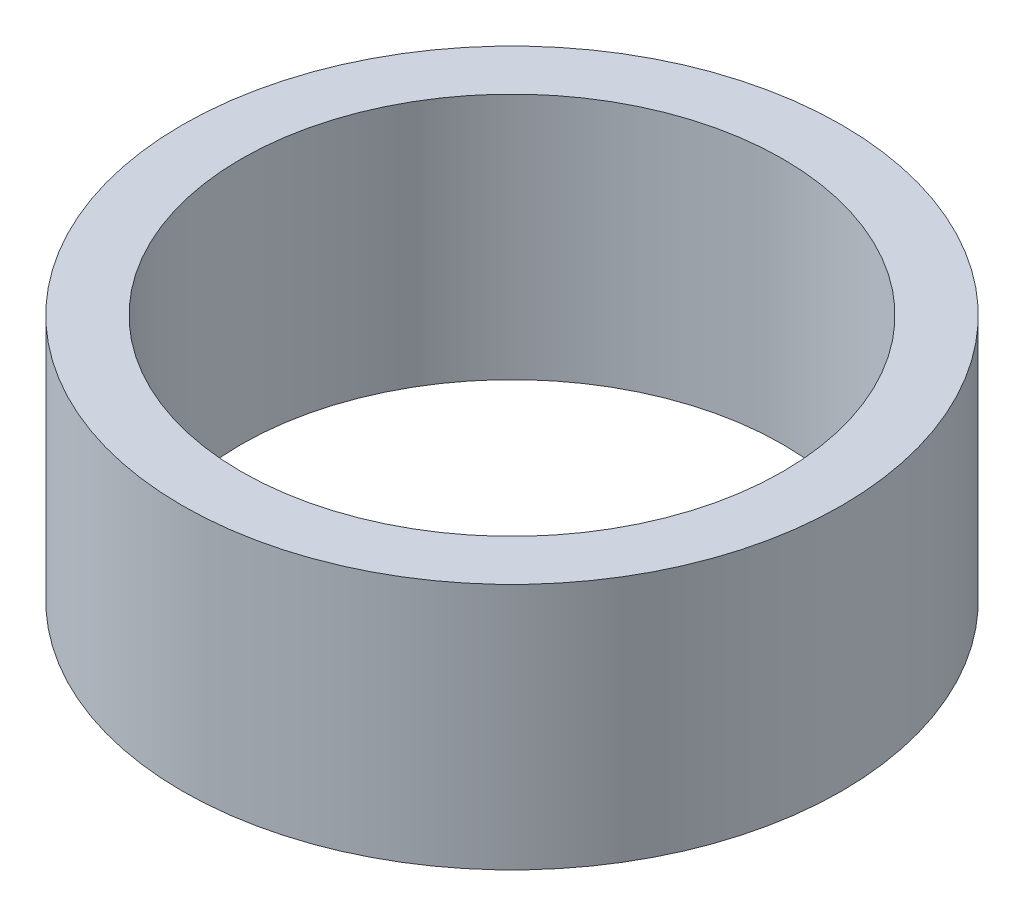
ISO-10303-21;
HEADER;
FILE_DESCRIPTION(('STEP AP214'),'2;1');
FILE_NAME('part.step','',(''),(''),'','','');
FILE_SCHEMA(('AUTOMOTIVE_DESIGN { 1 0 10303 214 1 1 1 1 }'));
ENDSEC;
DATA;
#1=APPLICATION_CONTEXT('core data for automotive mechanical design processes');
#2=APPLICATION_PROTOCOL_DEFINITION('international standard','automotive_design',2000,#1);
#3=PRODUCT_CONTEXT('',#1,'mechanical');
#4=PRODUCT('Part','Part','',(#3));
#5=PRODUCT_RELATED_PRODUCT_CATEGORY('part','',(#4));
#6=PRODUCT_DEFINITION_FORMATION('','',#4);
#7=PRODUCT_DEFINITION_CONTEXT('part definition',#1,'design');
#8=PRODUCT_DEFINITION('design','',#6,#7);
#9=PRODUCT_DEFINITION_SHAPE('','',#8);
#10=(LENGTH_UNIT() NAMED_UNIT(*) SI_UNIT(.MILLI.,.METRE.));
#11=(NAMED_UNIT(*) PLANE_ANGLE_UNIT() SI_UNIT($,.RADIAN.));
#12=(NAMED_UNIT(*) SI_UNIT($,.STERADIAN.) SOLID_ANGLE_UNIT());
#13=UNCERTAINTY_MEASURE_WITH_UNIT(LENGTH_MEASURE(1.E-05),#10,'distance_accuracy_value','');
#14=(GEOMETRIC_REPRESENTATION_CONTEXT(3) GLOBAL_UNCERTAINTY_ASSIGNED_CONTEXT((#13)) GLOBAL_UNIT_ASSIGNED_CONTEXT((#10,
#11,#12)) REPRESENTATION_CONTEXT('',''));
#15=CARTESIAN_POINT('',(0.,0.,0.));
#16=DIRECTION('',(0.,0.,1.));
#17=DIRECTION('',(1.,0.,0.));
#18=AXIS2_PLACEMENT_3D('',#15,#16,#17);
#19=CARTESIAN_POINT('',(0.,10.5,0.));
#20=DIRECTION('',(0.,1.,0.));
#21=DIRECTION('',(0.,0.,1.));
#22=AXIS2_PLACEMENT_3D('',#19,#20,#21);
#23=PLANE('',#22);
#24=CARTESIAN_POINT('',(0.,10.5,0.));
#25=DIRECTION('',(0.,1.,0.));
#26=DIRECTION('',(0.,0.,1.));
#27=AXIS2_PLACEMENT_3D('',#24,#25,#26);
#28=CIRCLE('',#27,14.);
#29=CARTESIAN_POINT('',(0.,10.5,-14.));
#30=VERTEX_POINT('',#29);
#31=EDGE_CURVE('E10',#30,#30,#28,.T.);
#32=ORIENTED_EDGE('',*,*,#31,.T.);
#33=EDGE_LOOP('',(#32));
#34=FACE_BOUND('',#33,.T.);
#35=CARTESIAN_POINT('',(0.,10.5,0.));
#36=DIRECTION('',(0.,1.,0.));
#37=DIRECTION('',(0.,0.,1.));
#38=AXIS2_PLACEMENT_3D('',#35,#36,#37);
#39=CIRCLE('',#38,11.5);
#40=CARTESIAN_POINT('',(0.,10.5,-11.5));
#41=VERTEX_POINT('',#40);
#42=EDGE_CURVE('E42',#41,#41,#39,.T.);
#43=ORIENTED_EDGE('',*,*,#42,.F.);
#44=EDGE_LOOP('',(#43));
#45=FACE_BOUND('',#44,.T.);
#46=ADVANCED_FACE('F31',(#34,#45),#23,.T.);
#47=CARTESIAN_POINT('',(0.,0.,0.));
#48=DIRECTION('',(0.,1.,0.));
#49=DIRECTION('',(0.,0.,1.));
#50=AXIS2_PLACEMENT_3D('',#47,#48,#49);
#51=PLANE('',#50);
#52=CARTESIAN_POINT('',(0.,0.,0.));
#53=DIRECTION('',(0.,1.,0.));
#54=DIRECTION('',(0.,0.,1.));
#55=AXIS2_PLACEMENT_3D('',#52,#53,#54);
#56=CIRCLE('',#55,14.);
#57=CARTESIAN_POINT('',(0.,0.,-14.));
#58=VERTEX_POINT('',#57);
#59=EDGE_CURVE('E35',#58,#58,#56,.T.);
#60=ORIENTED_EDGE('',*,*,#59,.F.);
#61=EDGE_LOOP('',(#60));
#62=FACE_BOUND('',#61,.T.);
#63=CARTESIAN_POINT('',(0.,0.,0.));
#64=DIRECTION('',(0.,1.,0.));
#65=DIRECTION('',(0.,0.,1.));
#66=AXIS2_PLACEMENT_3D('',#63,#64,#65);
#67=CIRCLE('',#66,11.5);
#68=CARTESIAN_POINT('',(0.,0.,-11.5));
#69=VERTEX_POINT('',#68);
#70=EDGE_CURVE('E44',#69,#69,#67,.T.);
#71=ORIENTED_EDGE('',*,*,#70,.T.);
#72=EDGE_LOOP('',(#71));
#73=FACE_BOUND('',#72,.T.);
#74=ADVANCED_FACE('F54',(#62,#73),#51,.F.);
#75=CARTESIAN_POINT('',(0.,10.5,0.));
#76=DIRECTION('',(0.,-1.,0.));
#77=DIRECTION('',(0.,0.,-1.));
#78=AXIS2_PLACEMENT_3D('',#75,#76,#77);
#79=CYLINDRICAL_SURFACE('',#78,14.);
#80=CARTESIAN_POINT('',(0.,10.5,-14.));
#81=CARTESIAN_POINT('',(0.,10.390625,-14.));
#82=CARTESIAN_POINT('',(0.,10.28125,-14.));
#83=CARTESIAN_POINT('',(0.,10.0625,-14.));
#84=CARTESIAN_POINT('',(0.,9.953125,-14.));
#85=CARTESIAN_POINT('',(0.,9.734375,-14.));
#86=CARTESIAN_POINT('',(0.,9.625,-14.));
#87=CARTESIAN_POINT('',(0.,9.40625,-14.));
#88=CARTESIAN_POINT('',(0.,9.296875,-14.));
#89=CARTESIAN_POINT('',(0.,9.078125,-14.));
#90=CARTESIAN_POINT('',(0.,8.96875,-14.));
#91=CARTESIAN_POINT('',(0.,8.75,-14.));
#92=CARTESIAN_POINT('',(0.,8.640625,-14.));
#93=CARTESIAN_POINT('',(0.,8.421875,-14.));
#94=CARTESIAN_POINT('',(0.,8.3125,-14.));
#95=CARTESIAN_POINT('',(0.,8.09375,-14.));
#96=CARTESIAN_POINT('',(0.,7.984375,-14.));
#97=CARTESIAN_POINT('',(0.,7.765625,-14.));
#98=CARTESIAN_POINT('',(0.,7.65625,-14.));
#99=CARTESIAN_POINT('',(0.,7.4375,-14.));
#100=CARTESIAN_POINT('',(0.,7.328125,-14.));
#101=CARTESIAN_POINT('',(0.,7.109375,-14.));
#102=CARTESIAN_POINT('',(0.,7.,-14.));
#103=CARTESIAN_POINT('',(0.,6.78125,-14.));
#104=CARTESIAN_POINT('',(0.,6.671875,-14.));
#105=CARTESIAN_POINT('',(0.,6.453125,-14.));
#106=CARTESIAN_POINT('',(0.,6.34375,-14.));
#107=CARTESIAN_POINT('',(0.,6.125,-14.));
#108=CARTESIAN_POINT('',(0.,6.015625,-14.));
#109=CARTESIAN_POINT('',(0.,5.796875,-14.));
#110=CARTESIAN_POINT('',(0.,5.6875,-14.));
#111=CARTESIAN_POINT('',(0.,5.46875,-14.));
#112=CARTESIAN_POINT('',(0.,5.359375,-14.));
#113=CARTESIAN_POINT('',(0.,5.140625,-14.));
#114=CARTESIAN_POINT('',(0.,5.03125,-14.));
#115=CARTESIAN_POINT('',(0.,4.8125,-14.));
#116=CARTESIAN_POINT('',(0.,4.703125,-14.));
#117=CARTESIAN_POINT('',(0.,4.484375,-14.));
#118=CARTESIAN_POINT('',(0.,4.375,-14.));
#119=CARTESIAN_POINT('',(0.,4.15625,-14.));
#120=CARTESIAN_POINT('',(0.,4.046875,-14.));
#121=CARTESIAN_POINT('',(0.,3.828125,-14.));
#122=CARTESIAN_POINT('',(0.,3.71875,-14.));
#123=CARTESIAN_POINT('',(0.,3.5,-14.));
#124=CARTESIAN_POINT('',(0.,3.390625,-14.));
#125=CARTESIAN_POINT('',(0.,3.171875,-14.));
#126=CARTESIAN_POINT('',(0.,3.0625,-14.));
#127=CARTESIAN_POINT('',(0.,2.84375,-14.));
#128=CARTESIAN_POINT('',(0.,2.734375,-14.));
#129=CARTESIAN_POINT('',(0.,2.515625,-14.));
#130=CARTESIAN_POINT('',(0.,2.40625,-14.));
#131=CARTESIAN_POINT('',(0.,2.1875,-14.));
#132=CARTESIAN_POINT('',(0.,2.078125,-14.));
#133=CARTESIAN_POINT('',(0.,1.859375,-14.));
#134=CARTESIAN_POINT('',(0.,1.75,-14.));
#135=CARTESIAN_POINT('',(0.,1.53125,-14.));
#136=CARTESIAN_POINT('',(0.,1.421875,-14.));
#137=CARTESIAN_POINT('',(0.,1.203125,-14.));
#138=CARTESIAN_POINT('',(0.,1.09375,-14.));
#139=CARTESIAN_POINT('',(0.,0.875000000000001,-14.));
#140=CARTESIAN_POINT('',(0.,0.765625000000001,-14.));
#141=CARTESIAN_POINT('',(0.,0.546875,-14.));
#142=CARTESIAN_POINT('',(0.,0.4375,-14.));
#143=CARTESIAN_POINT('',(0.,0.21875,-14.));
#144=CARTESIAN_POINT('',(0.,0.109375,-14.));
#145=CARTESIAN_POINT('',(0.,0.,-14.));
#146=B_SPLINE_CURVE_WITH_KNOTS('',3,(#80,#81,#82,#83,#84,#85,#86,#87,#88,#89,#90,#91,#92,#93,
#94,#95,#96,#97,#98,#99,#100,#101,#102,#103,#104,#105,#106,#107,#108,#109,#110,#111,#112,#113,
#114,#115,#116,#117,#118,#119,#120,#121,#122,#123,#124,#125,#126,#127,#128,#129,#130,#131,#132,
#133,#134,#135,#136,#137,#138,#139,#140,#141,#142,#143,#144,#145),.UNSPECIFIED.,.F.,.F.,(4,2,2,
2,2,2,2,2,2,2,2,2,2,2,2,2,2,2,2,2,2,2,2,2,2,2,2,2,2,2,2,2,4),(0.,0.328125,0.656250000000001,
0.984375000000001,1.3125,1.640625,1.96875,2.296875,2.625,2.953125,3.28125,3.609375,3.9375,
4.265625,4.59375,4.921875,5.25,5.578125,5.90625,6.234375,6.5625,6.890625,7.21875,7.546875,7.875,
8.203125,8.53125,8.859375,9.1875,9.515625,9.84375,10.171875,10.5),.UNSPECIFIED.);
#147=EDGE_CURVE('BSEAM33',#30,#58,#146,.T.);
#148=ORIENTED_EDGE('',*,*,#31,.F.);
#149=ORIENTED_EDGE('',*,*,#59,.T.);
#150=ORIENTED_EDGE('',*,*,#147,.T.);
#151=ORIENTED_EDGE('',*,*,#147,.F.);
#152=EDGE_LOOP('',(#148,#150,#149,#151));
#153=FACE_BOUND('',#152,.T.);
#154=ADVANCED_FACE('F33',(#153),#79,.T.);
#155=CARTESIAN_POINT('',(0.,10.5,0.));
#156=DIRECTION('',(0.,-1.,0.));
#157=DIRECTION('',(0.,0.,-1.));
#158=AXIS2_PLACEMENT_3D('',#155,#156,#157);
#159=CYLINDRICAL_SURFACE('',#158,11.5);
#160=CARTESIAN_POINT('',(0.,10.5,-11.5));
#161=CARTESIAN_POINT('',(0.,10.390625,-11.5));
#162=CARTESIAN_POINT('',(0.,10.28125,-11.5));
#163=CARTESIAN_POINT('',(0.,10.0625,-11.5));
#164=CARTESIAN_POINT('',(0.,9.953125,-11.5));
#165=CARTESIAN_POINT('',(0.,9.734375,-11.5));
#166=CARTESIAN_POINT('',(0.,9.625,-11.5));
#167=CARTESIAN_POINT('',(0.,9.40625,-11.5));
#168=CARTESIAN_POINT('',(0.,9.296875,-11.5));
#169=CARTESIAN_POINT('',(0.,9.078125,-11.5));
#170=CARTESIAN_POINT('',(0.,8.96875,-11.5));
#171=CARTESIAN_POINT('',(0.,8.75,-11.5));
#172=CARTESIAN_POINT('',(0.,8.640625,-11.5));
#173=CARTESIAN_POINT('',(0.,8.421875,-11.5));
#174=CARTESIAN_POINT('',(0.,8.3125,-11.5));
#175=CARTESIAN_POINT('',(0.,8.09375,-11.5));
#176=CARTESIAN_POINT('',(0.,7.984375,-11.5));
#177=CARTESIAN_POINT('',(0.,7.765625,-11.5));
#178=CARTESIAN_POINT('',(0.,7.65625,-11.5));
#179=CARTESIAN_POINT('',(0.,7.4375,-11.5));
#180=CARTESIAN_POINT('',(0.,7.328125,-11.5));
#181=CARTESIAN_POINT('',(0.,7.109375,-11.5));
#182=CARTESIAN_POINT('',(0.,7.,-11.5));
#183=CARTESIAN_POINT('',(0.,6.78125,-11.5));
#184=CARTESIAN_POINT('',(0.,6.671875,-11.5));
#185=CARTESIAN_POINT('',(0.,6.453125,-11.5));
#186=CARTESIAN_POINT('',(0.,6.34375,-11.5));
#187=CARTESIAN_POINT('',(0.,6.125,-11.5));
#188=CARTESIAN_POINT('',(0.,6.015625,-11.5));
#189=CARTESIAN_POINT('',(0.,5.796875,-11.5));
#190=CARTESIAN_POINT('',(0.,5.6875,-11.5));
#191=CARTESIAN_POINT('',(0.,5.46875,-11.5));
#192=CARTESIAN_POINT('',(0.,5.359375,-11.5));
#193=CARTESIAN_POINT('',(0.,5.140625,-11.5));
#194=CARTESIAN_POINT('',(0.,5.03125,-11.5));
#195=CARTESIAN_POINT('',(0.,4.8125,-11.5));
#196=CARTESIAN_POINT('',(0.,4.703125,-11.5));
#197=CARTESIAN_POINT('',(0.,4.484375,-11.5));
#198=CARTESIAN_POINT('',(0.,4.375,-11.5));
#199=CARTESIAN_POINT('',(0.,4.15625,-11.5));
#200=CARTESIAN_POINT('',(0.,4.046875,-11.5));
#201=CARTESIAN_POINT('',(0.,3.828125,-11.5));
#202=CARTESIAN_POINT('',(0.,3.71875,-11.5));
#203=CARTESIAN_POINT('',(0.,3.5,-11.5));
#204=CARTESIAN_POINT('',(0.,3.390625,-11.5));
#205=CARTESIAN_POINT('',(0.,3.171875,-11.5));
#206=CARTESIAN_POINT('',(0.,3.0625,-11.5));
#207=CARTESIAN_POINT('',(0.,2.84375,-11.5));
#208=CARTESIAN_POINT('',(0.,2.734375,-11.5));
#209=CARTESIAN_POINT('',(0.,2.515625,-11.5));
#210=CARTESIAN_POINT('',(0.,2.40625,-11.5));
#211=CARTESIAN_POINT('',(0.,2.1875,-11.5));
#212=CARTESIAN_POINT('',(0.,2.078125,-11.5));
#213=CARTESIAN_POINT('',(0.,1.859375,-11.5));
#214=CARTESIAN_POINT('',(0.,1.75,-11.5));
#215=CARTESIAN_POINT('',(0.,1.53125,-11.5));
#216=CARTESIAN_POINT('',(0.,1.421875,-11.5));
#217=CARTESIAN_POINT('',(0.,1.203125,-11.5));
#218=CARTESIAN_POINT('',(0.,1.09375,-11.5));
#219=CARTESIAN_POINT('',(0.,0.875000000000001,-11.5));
#220=CARTESIAN_POINT('',(0.,0.765625000000001,-11.5));
#221=CARTESIAN_POINT('',(0.,0.546875,-11.5));
#222=CARTESIAN_POINT('',(0.,0.4375,-11.5));
#223=CARTESIAN_POINT('',(0.,0.21875,-11.5));
#224=CARTESIAN_POINT('',(0.,0.109375,-11.5));
#225=CARTESIAN_POINT('',(0.,0.,-11.5));
#226=B_SPLINE_CURVE_WITH_KNOTS('',3,(#160,#161,#162,#163,#164,#165,#166,#167,#168,#169,#170,
#171,#172,#173,#174,#175,#176,#177,#178,#179,#180,#181,#182,#183,#184,#185,#186,#187,#188,#189,
#190,#191,#192,#193,#194,#195,#196,#197,#198,#199,#200,#201,#202,#203,#204,#205,#206,#207,#208,
#209,#210,#211,#212,#213,#214,#215,#216,#217,#218,#219,#220,#221,#222,#223,#224,#225),
.UNSPECIFIED.,.F.,.F.,(4,2,2,2,2,2,2,2,2,2,2,2,2,2,2,2,2,2,2,2,2,2,2,2,2,2,2,2,2,2,2,2,4),(0.,
0.328125,0.656250000000001,0.984375000000001,1.3125,1.640625,1.96875,2.296875,2.625,2.953125,
3.28125,3.609375,3.9375,4.265625,4.59375,4.921875,5.25,5.578125,5.90625,6.234375,6.5625,
6.890625,7.21875,7.546875,7.875,8.203125,8.53125,8.859375,9.1875,9.515625,9.84375,10.171875,
10.5),.UNSPECIFIED.);
#227=EDGE_CURVE('BSEAM50',#41,#69,#226,.T.);
#228=ORIENTED_EDGE('',*,*,#42,.T.);
#229=ORIENTED_EDGE('',*,*,#70,.F.);
#230=ORIENTED_EDGE('',*,*,#227,.T.);
#231=ORIENTED_EDGE('',*,*,#227,.F.);
#232=EDGE_LOOP('',(#228,#230,#229,#231));
#233=FACE_BOUND('',#232,.T.);
#234=ADVANCED_FACE('F50',(#233),#159,.F.);
#235=CLOSED_SHELL('',(#46,#74,#154,#234));
#236=MANIFOLD_SOLID_BREP('B2',#235);
#237=ADVANCED_BREP_SHAPE_REPRESENTATION('',(#18,#236),#14);
#238=SHAPE_DEFINITION_REPRESENTATION(#9,#237);
ENDSEC;
END-ISO-10303-21;
